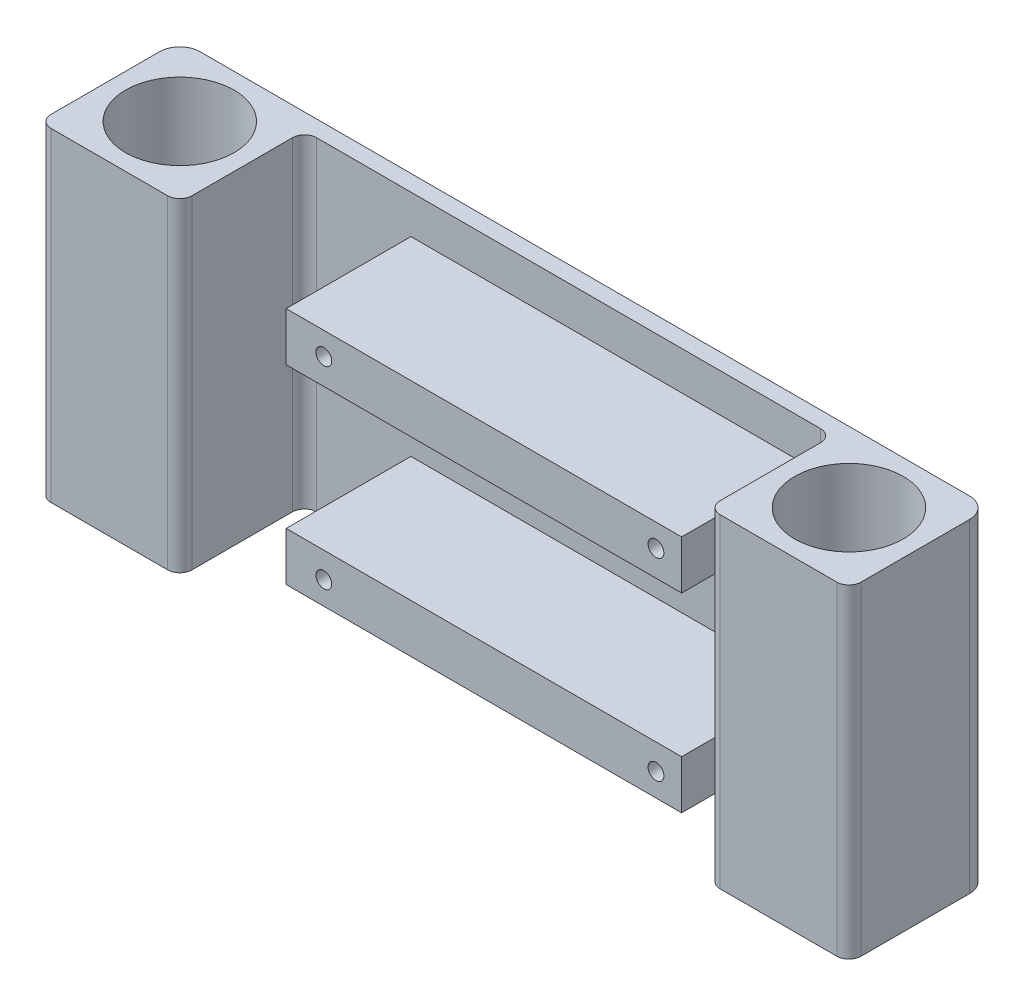
ISO-10303-21;
HEADER;
FILE_DESCRIPTION(('STEP AP214'),'2;1');
FILE_NAME('part.step','',(''),(''),'','','');
FILE_SCHEMA(('AUTOMOTIVE_DESIGN { 1 0 10303 214 1 1 1 1 }'));
ENDSEC;
DATA;
#1=APPLICATION_CONTEXT('core data for automotive mechanical design processes');
#2=APPLICATION_PROTOCOL_DEFINITION('international standard','automotive_design',2000,#1);
#3=PRODUCT_CONTEXT('',#1,'mechanical');
#4=PRODUCT('Part','Part','',(#3));
#5=PRODUCT_RELATED_PRODUCT_CATEGORY('part','',(#4));
#6=PRODUCT_DEFINITION_FORMATION('','',#4);
#7=PRODUCT_DEFINITION_CONTEXT('part definition',#1,'design');
#8=PRODUCT_DEFINITION('design','',#6,#7);
#9=PRODUCT_DEFINITION_SHAPE('','',#8);
#10=(LENGTH_UNIT() NAMED_UNIT(*) SI_UNIT(.MILLI.,.METRE.));
#11=(NAMED_UNIT(*) PLANE_ANGLE_UNIT() SI_UNIT($,.RADIAN.));
#12=(NAMED_UNIT(*) SI_UNIT($,.STERADIAN.) SOLID_ANGLE_UNIT());
#13=UNCERTAINTY_MEASURE_WITH_UNIT(LENGTH_MEASURE(1.E-05),#10,'distance_accuracy_value','');
#14=(GEOMETRIC_REPRESENTATION_CONTEXT(3) GLOBAL_UNCERTAINTY_ASSIGNED_CONTEXT((#13)) GLOBAL_UNIT_ASSIGNED_CONTEXT((#10,
#11,#12)) REPRESENTATION_CONTEXT('',''));
#15=CARTESIAN_POINT('',(0.,0.,0.));
#16=DIRECTION('',(0.,0.,1.));
#17=DIRECTION('',(1.,0.,0.));
#18=AXIS2_PLACEMENT_3D('',#15,#16,#17);
#19=CARTESIAN_POINT('',(0.,80.,-17.4));
#20=DIRECTION('',(0.,0.,-1.));
#21=DIRECTION('',(-1.,0.,0.));
#22=AXIS2_PLACEMENT_3D('',#19,#20,#21);
#23=PLANE('',#22);
#24=DIRECTION('',(1.,0.,0.));
#25=VECTOR('',#24,1.);
#26=CARTESIAN_POINT('',(0.,80.,-17.4));
#27=LINE('',#26,#25);
#28=CARTESIAN_POINT('',(-12.4,80.,-17.4));
#29=VERTEX_POINT('',#28);
#30=CARTESIAN_POINT('',(177.6,80.,-17.4));
#31=VERTEX_POINT('',#30);
#32=EDGE_CURVE('E317',#29,#31,#27,.T.);
#33=ORIENTED_EDGE('',*,*,#32,.T.);
#34=DIRECTION('',(0.,-1.,0.));
#35=VECTOR('',#34,1.);
#36=CARTESIAN_POINT('',(177.6,80.,-17.4));
#37=LINE('',#36,#35);
#38=CARTESIAN_POINT('',(177.6,0.,-17.4));
#39=VERTEX_POINT('',#38);
#40=EDGE_CURVE('E349',#31,#39,#37,.T.);
#41=ORIENTED_EDGE('',*,*,#40,.T.);
#42=DIRECTION('',(1.,0.,0.));
#43=VECTOR('',#42,1.);
#44=CARTESIAN_POINT('',(0.,0.,-17.4));
#45=LINE('',#44,#43);
#46=CARTESIAN_POINT('',(-12.4,0.,-17.4));
#47=VERTEX_POINT('',#46);
#48=EDGE_CURVE('E335',#47,#39,#45,.T.);
#49=ORIENTED_EDGE('',*,*,#48,.F.);
#50=DIRECTION('',(0.,-1.,0.));
#51=VECTOR('',#50,1.);
#52=CARTESIAN_POINT('',(-12.4,80.,-17.4));
#53=LINE('',#52,#51);
#54=EDGE_CURVE('E332',#47,#29,#53,.F.);
#55=ORIENTED_EDGE('',*,*,#54,.T.);
#56=EDGE_LOOP('',(#33,#41,#49,#55));
#57=FACE_BOUND('',#56,.T.);
#58=ADVANCED_FACE('F35',(#57),#23,.T.);
#59=CARTESIAN_POINT('',(-17.4,80.,0.));
#60=DIRECTION('',(1.,0.,0.));
#61=DIRECTION('',(0.,0.,-1.));
#62=AXIS2_PLACEMENT_3D('',#59,#60,#61);
#63=PLANE('',#62);
#64=DIRECTION('',(0.,0.,1.));
#65=VECTOR('',#64,1.);
#66=CARTESIAN_POINT('',(-17.4,0.,0.));
#67=LINE('',#66,#65);
#68=CARTESIAN_POINT('',(-17.4,0.,-12.4));
#69=VERTEX_POINT('',#68);
#70=CARTESIAN_POINT('',(-17.4,0.,14.4));
#71=VERTEX_POINT('',#70);
#72=EDGE_CURVE('E338',#69,#71,#67,.T.);
#73=ORIENTED_EDGE('',*,*,#72,.T.);
#74=DIRECTION('',(0.,-1.,0.));
#75=VECTOR('',#74,1.);
#76=CARTESIAN_POINT('',(-17.4,80.,14.4));
#77=LINE('',#76,#75);
#78=CARTESIAN_POINT('',(-17.4,80.,14.4));
#79=VERTEX_POINT('',#78);
#80=EDGE_CURVE('E402',#71,#79,#77,.F.);
#81=ORIENTED_EDGE('',*,*,#80,.T.);
#82=DIRECTION('',(0.,0.,1.));
#83=VECTOR('',#82,1.);
#84=CARTESIAN_POINT('',(-17.4,80.,0.));
#85=LINE('',#84,#83);
#86=CARTESIAN_POINT('',(-17.4,80.,-12.4));
#87=VERTEX_POINT('',#86);
#88=EDGE_CURVE('E321',#87,#79,#85,.T.);
#89=ORIENTED_EDGE('',*,*,#88,.F.);
#90=DIRECTION('',(0.,-1.,0.));
#91=VECTOR('',#90,1.);
#92=CARTESIAN_POINT('',(-17.4,0.,-12.4));
#93=LINE('',#92,#91);
#94=EDGE_CURVE('E362',#87,#69,#93,.T.);
#95=ORIENTED_EDGE('',*,*,#94,.T.);
#96=EDGE_LOOP('',(#73,#81,#89,#95));
#97=FACE_BOUND('',#96,.T.);
#98=ADVANCED_FACE('F470',(#97),#63,.F.);
#99=CARTESIAN_POINT('',(0.,80.,17.4));
#100=DIRECTION('',(0.,0.,-1.));
#101=DIRECTION('',(-1.,0.,0.));
#102=AXIS2_PLACEMENT_3D('',#99,#100,#101);
#103=PLANE('',#102);
#104=DIRECTION('',(1.,0.,0.));
#105=VECTOR('',#104,1.);
#106=CARTESIAN_POINT('',(0.,0.,17.4));
#107=LINE('',#106,#105);
#108=CARTESIAN_POINT('',(-14.4,0.,17.4));
#109=VERTEX_POINT('',#108);
#110=CARTESIAN_POINT('',(14.4,0.,17.4));
#111=VERTEX_POINT('',#110);
#112=EDGE_CURVE('E341',#109,#111,#107,.T.);
#113=ORIENTED_EDGE('',*,*,#112,.T.);
#114=DIRECTION('',(0.,-1.,0.));
#115=VECTOR('',#114,1.);
#116=CARTESIAN_POINT('',(14.4,80.,17.4));
#117=LINE('',#116,#115);
#118=CARTESIAN_POINT('',(14.4,80.,17.4));
#119=VERTEX_POINT('',#118);
#120=EDGE_CURVE('E400',#111,#119,#117,.F.);
#121=ORIENTED_EDGE('',*,*,#120,.T.);
#122=DIRECTION('',(1.,0.,0.));
#123=VECTOR('',#122,1.);
#124=CARTESIAN_POINT('',(0.,80.,17.4));
#125=LINE('',#124,#123);
#126=CARTESIAN_POINT('',(-14.4,80.,17.4));
#127=VERTEX_POINT('',#126);
#128=EDGE_CURVE('E324',#127,#119,#125,.T.);
#129=ORIENTED_EDGE('',*,*,#128,.F.);
#130=DIRECTION('',(0.,-1.,0.));
#131=VECTOR('',#130,1.);
#132=CARTESIAN_POINT('',(-14.4,80.,17.4));
#133=LINE('',#132,#131);
#134=EDGE_CURVE('E397',#127,#109,#133,.T.);
#135=ORIENTED_EDGE('',*,*,#134,.T.);
#136=EDGE_LOOP('',(#113,#121,#129,#135));
#137=FACE_BOUND('',#136,.T.);
#138=ADVANCED_FACE('F479',(#137),#103,.F.);
#139=CARTESIAN_POINT('',(17.4,80.,0.));
#140=DIRECTION('',(1.,0.,0.));
#141=DIRECTION('',(0.,0.,-1.));
#142=AXIS2_PLACEMENT_3D('',#139,#140,#141);
#143=PLANE('',#142);
#144=DIRECTION('',(0.,0.,1.));
#145=VECTOR('',#144,1.);
#146=CARTESIAN_POINT('',(17.4,0.,0.));
#147=LINE('',#146,#145);
#148=CARTESIAN_POINT('',(17.4,0.,-10.4));
#149=VERTEX_POINT('',#148);
#150=CARTESIAN_POINT('',(17.4,0.,14.4));
#151=VERTEX_POINT('',#150);
#152=EDGE_CURVE('E344',#149,#151,#147,.T.);
#153=ORIENTED_EDGE('',*,*,#152,.F.);
#154=DIRECTION('',(0.,-1.,0.));
#155=VECTOR('',#154,1.);
#156=CARTESIAN_POINT('',(17.4,80.,-10.4));
#157=LINE('',#156,#155);
#158=CARTESIAN_POINT('',(17.4,80.,-10.4));
#159=VERTEX_POINT('',#158);
#160=EDGE_CURVE('E409',#149,#159,#157,.F.);
#161=ORIENTED_EDGE('',*,*,#160,.T.);
#162=DIRECTION('',(0.,0.,1.));
#163=VECTOR('',#162,1.);
#164=CARTESIAN_POINT('',(17.4,80.,0.));
#165=LINE('',#164,#163);
#166=CARTESIAN_POINT('',(17.4,80.,14.4));
#167=VERTEX_POINT('',#166);
#168=EDGE_CURVE('E327',#159,#167,#165,.T.);
#169=ORIENTED_EDGE('',*,*,#168,.T.);
#170=DIRECTION('',(0.,-1.,0.));
#171=VECTOR('',#170,1.);
#172=CARTESIAN_POINT('',(17.4,0.,14.4));
#173=LINE('',#172,#171);
#174=EDGE_CURVE('E394',#167,#151,#173,.T.);
#175=ORIENTED_EDGE('',*,*,#174,.T.);
#176=EDGE_LOOP('',(#153,#161,#169,#175));
#177=FACE_BOUND('',#176,.T.);
#178=ADVANCED_FACE('F493',(#177),#143,.T.);
#179=CARTESIAN_POINT('',(0.,80.,0.));
#180=DIRECTION('',(0.,-1.,0.));
#181=DIRECTION('',(0.,0.,-1.));
#182=AXIS2_PLACEMENT_3D('',#179,#180,#181);
#183=CYLINDRICAL_SURFACE('',#182,13.4);
#184=CARTESIAN_POINT('',(0.,80.,0.));
#185=DIRECTION('',(0.,1.,0.));
#186=DIRECTION('',(0.,0.,1.));
#187=AXIS2_PLACEMENT_3D('',#184,#185,#186);
#188=CIRCLE('',#187,13.4);
#189=CARTESIAN_POINT('',(0.,80.,13.4));
#190=VERTEX_POINT('',#189);
#191=EDGE_CURVE('E314',#190,#190,#188,.T.);
#192=ORIENTED_EDGE('',*,*,#191,.T.);
#193=EDGE_LOOP('',(#192));
#194=FACE_BOUND('',#193,.T.);
#195=CARTESIAN_POINT('',(0.,0.,0.));
#196=DIRECTION('',(0.,1.,0.));
#197=DIRECTION('',(0.,0.,1.));
#198=AXIS2_PLACEMENT_3D('',#195,#196,#197);
#199=CIRCLE('',#198,13.4);
#200=CARTESIAN_POINT('',(0.,0.,13.4));
#201=VERTEX_POINT('',#200);
#202=EDGE_CURVE('E304',#201,#201,#199,.T.);
#203=ORIENTED_EDGE('',*,*,#202,.F.);
#204=EDGE_LOOP('',(#203));
#205=FACE_BOUND('',#204,.T.);
#206=ADVANCED_FACE('F495',(#194,#205),#183,.F.);
#207=CARTESIAN_POINT('',(0.,80.,-13.4));
#208=DIRECTION('',(0.,0.,-1.));
#209=DIRECTION('',(-1.,0.,0.));
#210=AXIS2_PLACEMENT_3D('',#207,#208,#209);
#211=PLANE('',#210);
#212=DIRECTION('',(1.,0.,0.));
#213=VECTOR('',#212,1.);
#214=CARTESIAN_POINT('',(141.285497720519,58.5,-13.4));
#215=LINE('',#214,#213);
#216=CARTESIAN_POINT('',(43.6593774492131,58.5,-13.4));
#217=VERTEX_POINT('',#216);
#218=CARTESIAN_POINT('',(141.285497720519,58.5,-13.4));
#219=VERTEX_POINT('',#218);
#220=EDGE_CURVE('E50',#217,#219,#215,.T.);
#221=ORIENTED_EDGE('',*,*,#220,.F.);
#222=DIRECTION('',(0.,-1.,0.));
#223=VECTOR('',#222,1.);
#224=CARTESIAN_POINT('',(43.6593774492131,58.5,-13.4));
#225=LINE('',#224,#223);
#226=CARTESIAN_POINT('',(43.6593774492131,70.5,-13.4));
#227=VERTEX_POINT('',#226);
#228=EDGE_CURVE('E55',#227,#217,#225,.T.);
#229=ORIENTED_EDGE('',*,*,#228,.F.);
#230=DIRECTION('',(-1.,0.,0.));
#231=VECTOR('',#230,1.);
#232=CARTESIAN_POINT('',(141.285497720519,70.5,-13.4));
#233=LINE('',#232,#231);
#234=CARTESIAN_POINT('',(141.285497720519,70.5,-13.4));
#235=VERTEX_POINT('',#234);
#236=EDGE_CURVE('E232',#235,#227,#233,.T.);
#237=ORIENTED_EDGE('',*,*,#236,.F.);
#238=DIRECTION('',(0.,1.,0.));
#239=VECTOR('',#238,1.);
#240=CARTESIAN_POINT('',(141.285497720519,58.5,-13.4));
#241=LINE('',#240,#239);
#242=EDGE_CURVE('E230',#219,#235,#241,.T.);
#243=ORIENTED_EDGE('',*,*,#242,.F.);
#244=EDGE_LOOP('',(#221,#229,#237,#243));
#245=FACE_BOUND('',#244,.T.);
#246=DIRECTION('',(1.,0.,0.));
#247=VECTOR('',#246,1.);
#248=CARTESIAN_POINT('',(141.285497720519,11.5,-13.4));
#249=LINE('',#248,#247);
#250=CARTESIAN_POINT('',(43.6593774492131,11.5,-13.4));
#251=VERTEX_POINT('',#250);
#252=CARTESIAN_POINT('',(141.285497720519,11.5,-13.4));
#253=VERTEX_POINT('',#252);
#254=EDGE_CURVE('E274',#251,#253,#249,.T.);
#255=ORIENTED_EDGE('',*,*,#254,.F.);
#256=DIRECTION('',(0.,-1.,0.));
#257=VECTOR('',#256,1.);
#258=CARTESIAN_POINT('',(43.6593774492131,11.5,-13.4));
#259=LINE('',#258,#257);
#260=CARTESIAN_POINT('',(43.6593774492131,23.5,-13.4));
#261=VERTEX_POINT('',#260);
#262=EDGE_CURVE('E271',#261,#251,#259,.T.);
#263=ORIENTED_EDGE('',*,*,#262,.F.);
#264=DIRECTION('',(-1.,0.,0.));
#265=VECTOR('',#264,1.);
#266=CARTESIAN_POINT('',(141.285497720519,23.5,-13.4));
#267=LINE('',#266,#265);
#268=CARTESIAN_POINT('',(141.285497720519,23.5,-13.4));
#269=VERTEX_POINT('',#268);
#270=EDGE_CURVE('E268',#269,#261,#267,.T.);
#271=ORIENTED_EDGE('',*,*,#270,.F.);
#272=DIRECTION('',(0.,1.,0.));
#273=VECTOR('',#272,1.);
#274=CARTESIAN_POINT('',(141.285497720519,11.5,-13.4));
#275=LINE('',#274,#273);
#276=EDGE_CURVE('E265',#253,#269,#275,.T.);
#277=ORIENTED_EDGE('',*,*,#276,.F.);
#278=EDGE_LOOP('',(#255,#263,#271,#277));
#279=FACE_BOUND('',#278,.T.);
#280=DIRECTION('',(1.,0.,0.));
#281=VECTOR('',#280,1.);
#282=CARTESIAN_POINT('',(0.,80.,-13.4));
#283=LINE('',#282,#281);
#284=CARTESIAN_POINT('',(20.4,80.,-13.4));
#285=VERTEX_POINT('',#284);
#286=CARTESIAN_POINT('',(144.8,80.,-13.4));
#287=VERTEX_POINT('',#286);
#288=EDGE_CURVE('E329',#285,#287,#283,.T.);
#289=ORIENTED_EDGE('',*,*,#288,.F.);
#290=DIRECTION('',(0.,-1.,0.));
#291=VECTOR('',#290,1.);
#292=CARTESIAN_POINT('',(20.4,80.,-13.4));
#293=LINE('',#292,#291);
#294=CARTESIAN_POINT('',(20.4,0.,-13.4));
#295=VERTEX_POINT('',#294);
#296=EDGE_CURVE('E406',#285,#295,#293,.T.);
#297=ORIENTED_EDGE('',*,*,#296,.T.);
#298=DIRECTION('',(1.,0.,0.));
#299=VECTOR('',#298,1.);
#300=CARTESIAN_POINT('',(0.,0.,-13.4));
#301=LINE('',#300,#299);
#302=CARTESIAN_POINT('',(144.8,0.,-13.4));
#303=VERTEX_POINT('',#302);
#304=EDGE_CURVE('E318',#295,#303,#301,.T.);
#305=ORIENTED_EDGE('',*,*,#304,.T.);
#306=DIRECTION('',(0.,-1.,0.));
#307=VECTOR('',#306,1.);
#308=CARTESIAN_POINT('',(144.8,80.,-13.4));
#309=LINE('',#308,#307);
#310=EDGE_CURVE('E404',#303,#287,#309,.F.);
#311=ORIENTED_EDGE('',*,*,#310,.T.);
#312=EDGE_LOOP('',(#289,#297,#305,#311));
#313=FACE_BOUND('',#312,.T.);
#314=ADVANCED_FACE('F427',(#245,#279,#313),#211,.F.);
#315=CARTESIAN_POINT('',(0.,80.,0.));
#316=DIRECTION('',(0.,1.,0.));
#317=DIRECTION('',(0.,0.,1.));
#318=AXIS2_PLACEMENT_3D('',#315,#316,#317);
#319=PLANE('',#318);
#320=ORIENTED_EDGE('',*,*,#191,.F.);
#321=EDGE_LOOP('',(#320));
#322=FACE_BOUND('',#321,.T.);
#323=DIRECTION('',(-1.,0.,0.));
#324=VECTOR('',#323,1.);
#325=CARTESIAN_POINT('',(165.2,80.,17.4));
#326=LINE('',#325,#324);
#327=CARTESIAN_POINT('',(179.6,80.,17.4));
#328=VERTEX_POINT('',#327);
#329=CARTESIAN_POINT('',(150.8,80.,17.4));
#330=VERTEX_POINT('',#329);
#331=EDGE_CURVE('E298',#328,#330,#326,.T.);
#332=ORIENTED_EDGE('',*,*,#331,.F.);
#333=CARTESIAN_POINT('',(179.6,80.,14.4));
#334=DIRECTION('',(0.,1.,0.));
#335=DIRECTION('',(0.,0.,1.));
#336=AXIS2_PLACEMENT_3D('',#333,#334,#335);
#337=CIRCLE('',#336,3.);
#338=CARTESIAN_POINT('',(182.6,80.,14.4));
#339=VERTEX_POINT('',#338);
#340=EDGE_CURVE('E389',#328,#339,#337,.T.);
#341=ORIENTED_EDGE('',*,*,#340,.T.);
#342=DIRECTION('',(0.,0.,1.));
#343=VECTOR('',#342,1.);
#344=CARTESIAN_POINT('',(182.6,80.,0.));
#345=LINE('',#344,#343);
#346=CARTESIAN_POINT('',(182.6,80.,-12.4));
#347=VERTEX_POINT('',#346);
#348=EDGE_CURVE('E301',#347,#339,#345,.T.);
#349=ORIENTED_EDGE('',*,*,#348,.F.);
#350=CARTESIAN_POINT('',(177.6,80.,-12.4));
#351=DIRECTION('',(0.,1.,0.));
#352=DIRECTION('',(0.,0.,1.));
#353=AXIS2_PLACEMENT_3D('',#350,#351,#352);
#354=CIRCLE('',#353,5.);
#355=EDGE_CURVE('E360',#347,#31,#354,.T.);
#356=ORIENTED_EDGE('',*,*,#355,.T.);
#357=ORIENTED_EDGE('',*,*,#32,.F.);
#358=CARTESIAN_POINT('',(-12.4,80.,-12.4));
#359=DIRECTION('',(0.,1.,0.));
#360=DIRECTION('',(0.,0.,1.));
#361=AXIS2_PLACEMENT_3D('',#358,#359,#360);
#362=CIRCLE('',#361,5.);
#363=EDGE_CURVE('E358',#29,#87,#362,.T.);
#364=ORIENTED_EDGE('',*,*,#363,.T.);
#365=ORIENTED_EDGE('',*,*,#88,.T.);
#366=CARTESIAN_POINT('',(-14.4,80.,14.4));
#367=DIRECTION('',(0.,1.,0.));
#368=DIRECTION('',(0.,0.,1.));
#369=AXIS2_PLACEMENT_3D('',#366,#367,#368);
#370=CIRCLE('',#369,3.);
#371=EDGE_CURVE('E382',#79,#127,#370,.T.);
#372=ORIENTED_EDGE('',*,*,#371,.T.);
#373=ORIENTED_EDGE('',*,*,#128,.T.);
#374=CARTESIAN_POINT('',(14.4,80.,14.4));
#375=DIRECTION('',(0.,1.,0.));
#376=DIRECTION('',(0.,0.,1.));
#377=AXIS2_PLACEMENT_3D('',#374,#375,#376);
#378=CIRCLE('',#377,3.);
#379=EDGE_CURVE('E384',#119,#167,#378,.T.);
#380=ORIENTED_EDGE('',*,*,#379,.T.);
#381=ORIENTED_EDGE('',*,*,#168,.F.);
#382=CARTESIAN_POINT('',(20.4,80.,-10.4));
#383=DIRECTION('',(0.,1.,0.));
#384=DIRECTION('',(0.,0.,1.));
#385=AXIS2_PLACEMENT_3D('',#382,#383,#384);
#386=CIRCLE('',#385,3.);
#387=EDGE_CURVE('E416',#159,#285,#386,.F.);
#388=ORIENTED_EDGE('',*,*,#387,.T.);
#389=ORIENTED_EDGE('',*,*,#288,.T.);
#390=CARTESIAN_POINT('',(144.8,80.,-10.4));
#391=DIRECTION('',(0.,1.,0.));
#392=DIRECTION('',(0.,0.,1.));
#393=AXIS2_PLACEMENT_3D('',#390,#391,#392);
#394=CIRCLE('',#393,3.);
#395=CARTESIAN_POINT('',(147.8,80.,-10.4));
#396=VERTEX_POINT('',#395);
#397=EDGE_CURVE('E11',#287,#396,#394,.F.);
#398=ORIENTED_EDGE('',*,*,#397,.T.);
#399=DIRECTION('',(0.,0.,1.));
#400=VECTOR('',#399,1.);
#401=CARTESIAN_POINT('',(147.8,80.,0.));
#402=LINE('',#401,#400);
#403=CARTESIAN_POINT('',(147.8,80.,14.4));
#404=VERTEX_POINT('',#403);
#405=EDGE_CURVE('E295',#396,#404,#402,.T.);
#406=ORIENTED_EDGE('',*,*,#405,.T.);
#407=CARTESIAN_POINT('',(150.8,80.,14.4));
#408=DIRECTION('',(0.,1.,0.));
#409=DIRECTION('',(0.,0.,1.));
#410=AXIS2_PLACEMENT_3D('',#407,#408,#409);
#411=CIRCLE('',#410,3.);
#412=EDGE_CURVE('E387',#404,#330,#411,.T.);
#413=ORIENTED_EDGE('',*,*,#412,.T.);
#414=EDGE_LOOP('',(#332,#341,#349,#356,#357,#364,#365,#372,#373,#380,#381,#388,#389,#398,#406,#413));
#415=FACE_BOUND('',#414,.T.);
#416=CARTESIAN_POINT('',(165.2,80.,0.));
#417=DIRECTION('',(0.,-1.,0.));
#418=DIRECTION('',(0.,0.,1.));
#419=AXIS2_PLACEMENT_3D('',#416,#417,#418);
#420=CIRCLE('',#419,13.4);
#421=CARTESIAN_POINT('',(165.2,80.,13.4));
#422=VERTEX_POINT('',#421);
#423=EDGE_CURVE('E292',#422,#422,#420,.T.);
#424=ORIENTED_EDGE('',*,*,#423,.T.);
#425=EDGE_LOOP('',(#424));
#426=FACE_BOUND('',#425,.T.);
#427=ADVANCED_FACE('F433',(#322,#415,#426),#319,.T.);
#428=CARTESIAN_POINT('',(0.,0.,0.));
#429=DIRECTION('',(0.,1.,0.));
#430=DIRECTION('',(0.,0.,1.));
#431=AXIS2_PLACEMENT_3D('',#428,#429,#430);
#432=PLANE('',#431);
#433=ORIENTED_EDGE('',*,*,#202,.T.);
#434=EDGE_LOOP('',(#433));
#435=FACE_BOUND('',#434,.T.);
#436=DIRECTION('',(0.,0.,1.));
#437=VECTOR('',#436,1.);
#438=CARTESIAN_POINT('',(182.6,0.,0.));
#439=LINE('',#438,#437);
#440=CARTESIAN_POINT('',(182.6,0.,-12.4));
#441=VERTEX_POINT('',#440);
#442=CARTESIAN_POINT('',(182.6,0.,14.4));
#443=VERTEX_POINT('',#442);
#444=EDGE_CURVE('E296',#441,#443,#439,.T.);
#445=ORIENTED_EDGE('',*,*,#444,.T.);
#446=CARTESIAN_POINT('',(179.6,0.,14.4));
#447=DIRECTION('',(0.,1.,0.));
#448=DIRECTION('',(0.,0.,1.));
#449=AXIS2_PLACEMENT_3D('',#446,#447,#448);
#450=CIRCLE('',#449,3.);
#451=CARTESIAN_POINT('',(179.6,0.,17.4));
#452=VERTEX_POINT('',#451);
#453=EDGE_CURVE('E375',#443,#452,#450,.F.);
#454=ORIENTED_EDGE('',*,*,#453,.T.);
#455=DIRECTION('',(-1.,0.,0.));
#456=VECTOR('',#455,1.);
#457=CARTESIAN_POINT('',(165.2,0.,17.4));
#458=LINE('',#457,#456);
#459=CARTESIAN_POINT('',(150.8,0.,17.4));
#460=VERTEX_POINT('',#459);
#461=EDGE_CURVE('E309',#452,#460,#458,.T.);
#462=ORIENTED_EDGE('',*,*,#461,.T.);
#463=CARTESIAN_POINT('',(150.8,0.,14.4));
#464=DIRECTION('',(0.,1.,0.));
#465=DIRECTION('',(0.,0.,1.));
#466=AXIS2_PLACEMENT_3D('',#463,#464,#465);
#467=CIRCLE('',#466,3.);
#468=CARTESIAN_POINT('',(147.8,0.,14.4));
#469=VERTEX_POINT('',#468);
#470=EDGE_CURVE('E372',#460,#469,#467,.F.);
#471=ORIENTED_EDGE('',*,*,#470,.T.);
#472=DIRECTION('',(0.,0.,1.));
#473=VECTOR('',#472,1.);
#474=CARTESIAN_POINT('',(147.8,0.,0.));
#475=LINE('',#474,#473);
#476=CARTESIAN_POINT('',(147.8,0.,-10.4));
#477=VERTEX_POINT('',#476);
#478=EDGE_CURVE('E307',#477,#469,#475,.T.);
#479=ORIENTED_EDGE('',*,*,#478,.F.);
#480=CARTESIAN_POINT('',(144.8,0.,-10.4));
#481=DIRECTION('',(0.,1.,0.));
#482=DIRECTION('',(0.,0.,1.));
#483=AXIS2_PLACEMENT_3D('',#480,#481,#482);
#484=CIRCLE('',#483,3.);
#485=EDGE_CURVE('E43',#477,#303,#484,.T.);
#486=ORIENTED_EDGE('',*,*,#485,.T.);
#487=ORIENTED_EDGE('',*,*,#304,.F.);
#488=CARTESIAN_POINT('',(20.4,0.,-10.4));
#489=DIRECTION('',(0.,1.,0.));
#490=DIRECTION('',(0.,0.,1.));
#491=AXIS2_PLACEMENT_3D('',#488,#489,#490);
#492=CIRCLE('',#491,3.);
#493=EDGE_CURVE('E414',#295,#149,#492,.T.);
#494=ORIENTED_EDGE('',*,*,#493,.T.);
#495=ORIENTED_EDGE('',*,*,#152,.T.);
#496=CARTESIAN_POINT('',(14.4,0.,14.4));
#497=DIRECTION('',(0.,1.,0.));
#498=DIRECTION('',(0.,0.,1.));
#499=AXIS2_PLACEMENT_3D('',#496,#497,#498);
#500=CIRCLE('',#499,3.);
#501=EDGE_CURVE('E370',#151,#111,#500,.F.);
#502=ORIENTED_EDGE('',*,*,#501,.T.);
#503=ORIENTED_EDGE('',*,*,#112,.F.);
#504=CARTESIAN_POINT('',(-14.4,0.,14.4));
#505=DIRECTION('',(0.,1.,0.));
#506=DIRECTION('',(0.,0.,1.));
#507=AXIS2_PLACEMENT_3D('',#504,#505,#506);
#508=CIRCLE('',#507,3.);
#509=EDGE_CURVE('E368',#109,#71,#508,.F.);
#510=ORIENTED_EDGE('',*,*,#509,.T.);
#511=ORIENTED_EDGE('',*,*,#72,.F.);
#512=CARTESIAN_POINT('',(-12.4,0.,-12.4));
#513=DIRECTION('',(0.,1.,0.));
#514=DIRECTION('',(0.,0.,1.));
#515=AXIS2_PLACEMENT_3D('',#512,#513,#514);
#516=CIRCLE('',#515,5.);
#517=EDGE_CURVE('E352',#69,#47,#516,.F.);
#518=ORIENTED_EDGE('',*,*,#517,.T.);
#519=ORIENTED_EDGE('',*,*,#48,.T.);
#520=CARTESIAN_POINT('',(177.6,0.,-12.4));
#521=DIRECTION('',(0.,1.,0.));
#522=DIRECTION('',(0.,0.,1.));
#523=AXIS2_PLACEMENT_3D('',#520,#521,#522);
#524=CIRCLE('',#523,5.);
#525=EDGE_CURVE('E354',#39,#441,#524,.F.);
#526=ORIENTED_EDGE('',*,*,#525,.T.);
#527=EDGE_LOOP('',(#445,#454,#462,#471,#479,#486,#487,#494,#495,#502,#503,#510,#511,#518,#519,#526));
#528=FACE_BOUND('',#527,.T.);
#529=CARTESIAN_POINT('',(165.2,0.,0.));
#530=DIRECTION('',(0.,-1.,0.));
#531=DIRECTION('',(0.,0.,1.));
#532=AXIS2_PLACEMENT_3D('',#529,#530,#531);
#533=CIRCLE('',#532,13.4);
#534=CARTESIAN_POINT('',(165.2,0.,13.4));
#535=VERTEX_POINT('',#534);
#536=EDGE_CURVE('E289',#535,#535,#533,.T.);
#537=ORIENTED_EDGE('',*,*,#536,.F.);
#538=EDGE_LOOP('',(#537));
#539=FACE_BOUND('',#538,.T.);
#540=ADVANCED_FACE('F420',(#435,#528,#539),#432,.F.);
#541=CARTESIAN_POINT('',(147.8,80.,0.));
#542=DIRECTION('',(1.,0.,0.));
#543=DIRECTION('',(0.,0.,-1.));
#544=AXIS2_PLACEMENT_3D('',#541,#542,#543);
#545=PLANE('',#544);
#546=ORIENTED_EDGE('',*,*,#405,.F.);
#547=DIRECTION('',(0.,-1.,0.));
#548=VECTOR('',#547,1.);
#549=CARTESIAN_POINT('',(147.8,0.,-10.4));
#550=LINE('',#549,#548);
#551=EDGE_CURVE('E411',#396,#477,#550,.T.);
#552=ORIENTED_EDGE('',*,*,#551,.T.);
#553=ORIENTED_EDGE('',*,*,#478,.T.);
#554=DIRECTION('',(0.,-1.,0.));
#555=VECTOR('',#554,1.);
#556=CARTESIAN_POINT('',(147.8,80.,14.4));
#557=LINE('',#556,#555);
#558=EDGE_CURVE('E391',#469,#404,#557,.F.);
#559=ORIENTED_EDGE('',*,*,#558,.T.);
#560=EDGE_LOOP('',(#546,#552,#553,#559));
#561=FACE_BOUND('',#560,.T.);
#562=ADVANCED_FACE('F436',(#561),#545,.F.);
#563=CARTESIAN_POINT('',(165.2,80.,17.4));
#564=DIRECTION('',(0.,0.,1.));
#565=DIRECTION('',(1.,0.,0.));
#566=AXIS2_PLACEMENT_3D('',#563,#564,#565);
#567=PLANE('',#566);
#568=ORIENTED_EDGE('',*,*,#461,.F.);
#569=DIRECTION('',(0.,-1.,0.));
#570=VECTOR('',#569,1.);
#571=CARTESIAN_POINT('',(179.6,80.,17.4));
#572=LINE('',#571,#570);
#573=EDGE_CURVE('E380',#452,#328,#572,.F.);
#574=ORIENTED_EDGE('',*,*,#573,.T.);
#575=ORIENTED_EDGE('',*,*,#331,.T.);
#576=DIRECTION('',(0.,-1.,0.));
#577=VECTOR('',#576,1.);
#578=CARTESIAN_POINT('',(150.8,0.,17.4));
#579=LINE('',#578,#577);
#580=EDGE_CURVE('E377',#330,#460,#579,.T.);
#581=ORIENTED_EDGE('',*,*,#580,.T.);
#582=EDGE_LOOP('',(#568,#574,#575,#581));
#583=FACE_BOUND('',#582,.T.);
#584=ADVANCED_FACE('F445',(#583),#567,.T.);
#585=CARTESIAN_POINT('',(182.6,80.,0.));
#586=DIRECTION('',(1.,0.,0.));
#587=DIRECTION('',(0.,0.,-1.));
#588=AXIS2_PLACEMENT_3D('',#585,#586,#587);
#589=PLANE('',#588);
#590=ORIENTED_EDGE('',*,*,#348,.T.);
#591=DIRECTION('',(0.,-1.,0.));
#592=VECTOR('',#591,1.);
#593=CARTESIAN_POINT('',(182.6,80.,14.4));
#594=LINE('',#593,#592);
#595=EDGE_CURVE('E365',#339,#443,#594,.T.);
#596=ORIENTED_EDGE('',*,*,#595,.T.);
#597=ORIENTED_EDGE('',*,*,#444,.F.);
#598=DIRECTION('',(0.,-1.,0.));
#599=VECTOR('',#598,1.);
#600=CARTESIAN_POINT('',(182.6,80.,-12.4));
#601=LINE('',#600,#599);
#602=EDGE_CURVE('E356',#441,#347,#601,.F.);
#603=ORIENTED_EDGE('',*,*,#602,.T.);
#604=EDGE_LOOP('',(#590,#596,#597,#603));
#605=FACE_BOUND('',#604,.T.);
#606=ADVANCED_FACE('F453',(#605),#589,.T.);
#607=CARTESIAN_POINT('',(165.2,80.,0.));
#608=DIRECTION('',(0.,-1.,0.));
#609=DIRECTION('',(0.,0.,-1.));
#610=AXIS2_PLACEMENT_3D('',#607,#608,#609);
#611=CYLINDRICAL_SURFACE('',#610,13.4);
#612=ORIENTED_EDGE('',*,*,#423,.F.);
#613=EDGE_LOOP('',(#612));
#614=FACE_BOUND('',#613,.T.);
#615=ORIENTED_EDGE('',*,*,#536,.T.);
#616=EDGE_LOOP('',(#615));
#617=FACE_BOUND('',#616,.T.);
#618=ADVANCED_FACE('F514',(#614,#617),#611,.F.);
#619=CARTESIAN_POINT('',(177.6,80.,-12.4));
#620=DIRECTION('',(0.,-1.,0.));
#621=DIRECTION('',(0.,0.,-1.));
#622=AXIS2_PLACEMENT_3D('',#619,#620,#621);
#623=CYLINDRICAL_SURFACE('',#622,5.);
#624=ORIENTED_EDGE('',*,*,#355,.F.);
#625=ORIENTED_EDGE('',*,*,#602,.F.);
#626=ORIENTED_EDGE('',*,*,#525,.F.);
#627=ORIENTED_EDGE('',*,*,#40,.F.);
#628=EDGE_LOOP('',(#624,#625,#626,#627));
#629=FACE_BOUND('',#628,.T.);
#630=ADVANCED_FACE('F457',(#629),#623,.T.);
#631=CARTESIAN_POINT('',(-12.4,80.,-12.4));
#632=DIRECTION('',(0.,1.,0.));
#633=DIRECTION('',(0.,0.,1.));
#634=AXIS2_PLACEMENT_3D('',#631,#632,#633);
#635=CYLINDRICAL_SURFACE('',#634,5.);
#636=ORIENTED_EDGE('',*,*,#363,.F.);
#637=ORIENTED_EDGE('',*,*,#54,.F.);
#638=ORIENTED_EDGE('',*,*,#517,.F.);
#639=ORIENTED_EDGE('',*,*,#94,.F.);
#640=EDGE_LOOP('',(#636,#637,#638,#639));
#641=FACE_BOUND('',#640,.T.);
#642=ADVANCED_FACE('F465',(#641),#635,.T.);
#643=CARTESIAN_POINT('',(179.6,80.,14.4));
#644=DIRECTION('',(0.,-1.,0.));
#645=DIRECTION('',(0.,0.,-1.));
#646=AXIS2_PLACEMENT_3D('',#643,#644,#645);
#647=CYLINDRICAL_SURFACE('',#646,3.);
#648=ORIENTED_EDGE('',*,*,#340,.F.);
#649=ORIENTED_EDGE('',*,*,#573,.F.);
#650=ORIENTED_EDGE('',*,*,#453,.F.);
#651=ORIENTED_EDGE('',*,*,#595,.F.);
#652=EDGE_LOOP('',(#648,#649,#650,#651));
#653=FACE_BOUND('',#652,.T.);
#654=ADVANCED_FACE('F448',(#653),#647,.T.);
#655=CARTESIAN_POINT('',(150.8,80.,14.4));
#656=DIRECTION('',(0.,1.,0.));
#657=DIRECTION('',(0.,0.,1.));
#658=AXIS2_PLACEMENT_3D('',#655,#656,#657);
#659=CYLINDRICAL_SURFACE('',#658,3.);
#660=ORIENTED_EDGE('',*,*,#412,.F.);
#661=ORIENTED_EDGE('',*,*,#558,.F.);
#662=ORIENTED_EDGE('',*,*,#470,.F.);
#663=ORIENTED_EDGE('',*,*,#580,.F.);
#664=EDGE_LOOP('',(#660,#661,#662,#663));
#665=FACE_BOUND('',#664,.T.);
#666=ADVANCED_FACE('F441',(#665),#659,.T.);
#667=CARTESIAN_POINT('',(14.4,80.,14.4));
#668=DIRECTION('',(0.,1.,0.));
#669=DIRECTION('',(0.,0.,1.));
#670=AXIS2_PLACEMENT_3D('',#667,#668,#669);
#671=CYLINDRICAL_SURFACE('',#670,3.);
#672=ORIENTED_EDGE('',*,*,#379,.F.);
#673=ORIENTED_EDGE('',*,*,#120,.F.);
#674=ORIENTED_EDGE('',*,*,#501,.F.);
#675=ORIENTED_EDGE('',*,*,#174,.F.);
#676=EDGE_LOOP('',(#672,#673,#674,#675));
#677=FACE_BOUND('',#676,.T.);
#678=ADVANCED_FACE('F484',(#677),#671,.T.);
#679=CARTESIAN_POINT('',(-14.4,80.,14.4));
#680=DIRECTION('',(0.,-1.,0.));
#681=DIRECTION('',(0.,0.,-1.));
#682=AXIS2_PLACEMENT_3D('',#679,#680,#681);
#683=CYLINDRICAL_SURFACE('',#682,3.);
#684=ORIENTED_EDGE('',*,*,#371,.F.);
#685=ORIENTED_EDGE('',*,*,#80,.F.);
#686=ORIENTED_EDGE('',*,*,#509,.F.);
#687=ORIENTED_EDGE('',*,*,#134,.F.);
#688=EDGE_LOOP('',(#684,#685,#686,#687));
#689=FACE_BOUND('',#688,.T.);
#690=ADVANCED_FACE('F474',(#689),#683,.T.);
#691=CARTESIAN_POINT('',(20.4,80.,-10.4));
#692=DIRECTION('',(0.,-1.,0.));
#693=DIRECTION('',(0.,0.,-1.));
#694=AXIS2_PLACEMENT_3D('',#691,#692,#693);
#695=CYLINDRICAL_SURFACE('',#694,3.);
#696=ORIENTED_EDGE('',*,*,#387,.F.);
#697=ORIENTED_EDGE('',*,*,#160,.F.);
#698=ORIENTED_EDGE('',*,*,#493,.F.);
#699=ORIENTED_EDGE('',*,*,#296,.F.);
#700=EDGE_LOOP('',(#696,#697,#698,#699));
#701=FACE_BOUND('',#700,.T.);
#702=ADVANCED_FACE('F491',(#701),#695,.F.);
#703=CARTESIAN_POINT('',(144.8,80.,-10.4));
#704=DIRECTION('',(0.,1.,0.));
#705=DIRECTION('',(0.,0.,1.));
#706=AXIS2_PLACEMENT_3D('',#703,#704,#705);
#707=CYLINDRICAL_SURFACE('',#706,3.);
#708=ORIENTED_EDGE('',*,*,#397,.F.);
#709=ORIENTED_EDGE('',*,*,#310,.F.);
#710=ORIENTED_EDGE('',*,*,#485,.F.);
#711=ORIENTED_EDGE('',*,*,#551,.F.);
#712=EDGE_LOOP('',(#708,#709,#710,#711));
#713=FACE_BOUND('',#712,.T.);
#714=ADVANCED_FACE('F37',(#713),#707,.F.);
#715=CARTESIAN_POINT('',(52.955461896114,17.1906054290218,115.760862944707));
#716=DIRECTION('',(0.,0.,-1.));
#717=DIRECTION('',(-1.,0.,0.));
#718=AXIS2_PLACEMENT_3D('',#715,#716,#717);
#719=CYLINDRICAL_SURFACE('',#718,1.95);
#720=CARTESIAN_POINT('',(52.955461896114,17.1906054290218,-13.4));
#721=DIRECTION('',(0.,0.,1.));
#722=DIRECTION('',(1.,0.,0.));
#723=AXIS2_PLACEMENT_3D('',#720,#721,#722);
#724=CIRCLE('',#723,1.95);
#725=CARTESIAN_POINT('',(54.905461896114,17.1906054290218,-13.4));
#726=VERTEX_POINT('',#725);
#727=EDGE_CURVE('E262',#726,#726,#724,.T.);
#728=ORIENTED_EDGE('',*,*,#727,.F.);
#729=EDGE_LOOP('',(#728));
#730=FACE_BOUND('',#729,.T.);
#731=CARTESIAN_POINT('',(52.955461896114,17.1906054290218,17.4));
#732=DIRECTION('',(0.,0.,1.));
#733=DIRECTION('',(1.,0.,0.));
#734=AXIS2_PLACEMENT_3D('',#731,#732,#733);
#735=CIRCLE('',#734,1.95);
#736=CARTESIAN_POINT('',(54.905461896114,17.1906054290218,17.4));
#737=VERTEX_POINT('',#736);
#738=EDGE_CURVE('E244',#737,#737,#735,.T.);
#739=ORIENTED_EDGE('',*,*,#738,.T.);
#740=EDGE_LOOP('',(#739));
#741=FACE_BOUND('',#740,.T.);
#742=ADVANCED_FACE('F528',(#730,#741),#719,.F.);
#743=CARTESIAN_POINT('',(141.285497720519,11.5,115.760862944707));
#744=DIRECTION('',(0.,1.,0.));
#745=DIRECTION('',(0.,0.,1.));
#746=AXIS2_PLACEMENT_3D('',#743,#744,#745);
#747=PLANE('',#746);
#748=DIRECTION('',(1.,0.,0.));
#749=VECTOR('',#748,1.);
#750=CARTESIAN_POINT('',(141.285497720519,11.5,17.4));
#751=LINE('',#750,#749);
#752=CARTESIAN_POINT('',(43.6593774492131,11.5,17.4));
#753=VERTEX_POINT('',#752);
#754=CARTESIAN_POINT('',(141.285497720519,11.5,17.4));
#755=VERTEX_POINT('',#754);
#756=EDGE_CURVE('E247',#753,#755,#751,.T.);
#757=ORIENTED_EDGE('',*,*,#756,.F.);
#758=DIRECTION('',(0.,0.,-1.));
#759=VECTOR('',#758,1.);
#760=CARTESIAN_POINT('',(43.6593774492131,11.5,115.760862944707));
#761=LINE('',#760,#759);
#762=EDGE_CURVE('E280',#753,#251,#761,.T.);
#763=ORIENTED_EDGE('',*,*,#762,.T.);
#764=ORIENTED_EDGE('',*,*,#254,.T.);
#765=DIRECTION('',(0.,0.,-1.));
#766=VECTOR('',#765,1.);
#767=CARTESIAN_POINT('',(141.285497720519,11.5,115.760862944707));
#768=LINE('',#767,#766);
#769=EDGE_CURVE('E277',#755,#253,#768,.T.);
#770=ORIENTED_EDGE('',*,*,#769,.F.);
#771=EDGE_LOOP('',(#757,#763,#764,#770));
#772=FACE_BOUND('',#771,.T.);
#773=ADVANCED_FACE('F532',(#772),#747,.F.);
#774=CARTESIAN_POINT('',(43.6593774492131,11.5,115.760862944707));
#775=DIRECTION('',(1.,0.,0.));
#776=DIRECTION('',(0.,0.,-1.));
#777=AXIS2_PLACEMENT_3D('',#774,#775,#776);
#778=PLANE('',#777);
#779=DIRECTION('',(0.,-1.,0.));
#780=VECTOR('',#779,1.);
#781=CARTESIAN_POINT('',(43.6593774492131,11.5,17.4));
#782=LINE('',#781,#780);
#783=CARTESIAN_POINT('',(43.6593774492131,23.5,17.4));
#784=VERTEX_POINT('',#783);
#785=EDGE_CURVE('E250',#784,#753,#782,.T.);
#786=ORIENTED_EDGE('',*,*,#785,.F.);
#787=DIRECTION('',(0.,0.,-1.));
#788=VECTOR('',#787,1.);
#789=CARTESIAN_POINT('',(43.6593774492131,23.5,115.760862944707));
#790=LINE('',#789,#788);
#791=EDGE_CURVE('E283',#784,#261,#790,.T.);
#792=ORIENTED_EDGE('',*,*,#791,.T.);
#793=ORIENTED_EDGE('',*,*,#262,.T.);
#794=ORIENTED_EDGE('',*,*,#762,.F.);
#795=EDGE_LOOP('',(#786,#792,#793,#794));
#796=FACE_BOUND('',#795,.T.);
#797=ADVANCED_FACE('F538',(#796),#778,.F.);
#798=CARTESIAN_POINT('',(141.285497720519,23.5,115.760862944707));
#799=DIRECTION('',(0.,-1.,0.));
#800=DIRECTION('',(0.,0.,-1.));
#801=AXIS2_PLACEMENT_3D('',#798,#799,#800);
#802=PLANE('',#801);
#803=DIRECTION('',(-1.,0.,0.));
#804=VECTOR('',#803,1.);
#805=CARTESIAN_POINT('',(141.285497720519,23.5,17.4));
#806=LINE('',#805,#804);
#807=CARTESIAN_POINT('',(141.285497720519,23.5,17.4));
#808=VERTEX_POINT('',#807);
#809=EDGE_CURVE('E253',#808,#784,#806,.T.);
#810=ORIENTED_EDGE('',*,*,#809,.F.);
#811=DIRECTION('',(0.,0.,-1.));
#812=VECTOR('',#811,1.);
#813=CARTESIAN_POINT('',(141.285497720519,23.5,115.760862944707));
#814=LINE('',#813,#812);
#815=EDGE_CURVE('E286',#808,#269,#814,.T.);
#816=ORIENTED_EDGE('',*,*,#815,.T.);
#817=ORIENTED_EDGE('',*,*,#270,.T.);
#818=ORIENTED_EDGE('',*,*,#791,.F.);
#819=EDGE_LOOP('',(#810,#816,#817,#818));
#820=FACE_BOUND('',#819,.T.);
#821=ADVANCED_FACE('F549',(#820),#802,.F.);
#822=CARTESIAN_POINT('',(141.285497720519,11.5,115.760862944707));
#823=DIRECTION('',(-1.,0.,0.));
#824=DIRECTION('',(0.,-1.,0.));
#825=AXIS2_PLACEMENT_3D('',#822,#823,#824);
#826=PLANE('',#825);
#827=DIRECTION('',(0.,1.,0.));
#828=VECTOR('',#827,1.);
#829=CARTESIAN_POINT('',(141.285497720519,11.5,17.4));
#830=LINE('',#829,#828);
#831=EDGE_CURVE('E256',#755,#808,#830,.T.);
#832=ORIENTED_EDGE('',*,*,#831,.F.);
#833=ORIENTED_EDGE('',*,*,#769,.T.);
#834=ORIENTED_EDGE('',*,*,#276,.T.);
#835=ORIENTED_EDGE('',*,*,#815,.F.);
#836=EDGE_LOOP('',(#832,#833,#834,#835));
#837=FACE_BOUND('',#836,.T.);
#838=ADVANCED_FACE('F553',(#837),#826,.F.);
#839=CARTESIAN_POINT('',(134.955461896114,17.1906054290218,115.760862944707));
#840=DIRECTION('',(0.,0.,-1.));
#841=DIRECTION('',(-1.,0.,0.));
#842=AXIS2_PLACEMENT_3D('',#839,#840,#841);
#843=CYLINDRICAL_SURFACE('',#842,1.95);
#844=CARTESIAN_POINT('',(134.955461896114,17.1906054290218,-13.4));
#845=DIRECTION('',(0.,0.,1.));
#846=DIRECTION('',(1.,0.,0.));
#847=AXIS2_PLACEMENT_3D('',#844,#845,#846);
#848=CIRCLE('',#847,1.95);
#849=CARTESIAN_POINT('',(136.905461896114,17.1906054290218,-13.4));
#850=VERTEX_POINT('',#849);
#851=EDGE_CURVE('E259',#850,#850,#848,.T.);
#852=ORIENTED_EDGE('',*,*,#851,.F.);
#853=EDGE_LOOP('',(#852));
#854=FACE_BOUND('',#853,.T.);
#855=CARTESIAN_POINT('',(134.955461896114,17.1906054290218,17.4));
#856=DIRECTION('',(0.,0.,1.));
#857=DIRECTION('',(1.,0.,0.));
#858=AXIS2_PLACEMENT_3D('',#855,#856,#857);
#859=CIRCLE('',#858,1.95);
#860=CARTESIAN_POINT('',(136.905461896114,17.1906054290218,17.4));
#861=VERTEX_POINT('',#860);
#862=EDGE_CURVE('E241',#861,#861,#859,.T.);
#863=ORIENTED_EDGE('',*,*,#862,.T.);
#864=EDGE_LOOP('',(#863));
#865=FACE_BOUND('',#864,.T.);
#866=ADVANCED_FACE('F544',(#854,#865),#843,.F.);
#867=CARTESIAN_POINT('',(165.2,80.,17.4));
#868=DIRECTION('',(0.,0.,1.));
#869=DIRECTION('',(1.,0.,0.));
#870=AXIS2_PLACEMENT_3D('',#867,#868,#869);
#871=PLANE('',#870);
#872=ORIENTED_EDGE('',*,*,#862,.F.);
#873=EDGE_LOOP('',(#872));
#874=FACE_BOUND('',#873,.T.);
#875=ORIENTED_EDGE('',*,*,#738,.F.);
#876=EDGE_LOOP('',(#875));
#877=FACE_BOUND('',#876,.T.);
#878=ORIENTED_EDGE('',*,*,#756,.T.);
#879=ORIENTED_EDGE('',*,*,#831,.T.);
#880=ORIENTED_EDGE('',*,*,#809,.T.);
#881=ORIENTED_EDGE('',*,*,#785,.T.);
#882=EDGE_LOOP('',(#878,#879,#880,#881));
#883=FACE_BOUND('',#882,.T.);
#884=ADVANCED_FACE('F591',(#874,#877,#883),#871,.T.);
#885=ORIENTED_EDGE('',*,*,#727,.T.);
#886=EDGE_LOOP('',(#885));
#887=FACE_BOUND('',#886,.T.);
#888=ADVANCED_FACE('F583',(#887),#211,.F.);
#889=ORIENTED_EDGE('',*,*,#851,.T.);
#890=EDGE_LOOP('',(#889));
#891=FACE_BOUND('',#890,.T.);
#892=ADVANCED_FACE('F574',(#891),#211,.F.);
#893=CARTESIAN_POINT('',(52.955461896114,64.8906054290218,115.760862944707));
#894=DIRECTION('',(0.,0.,-1.));
#895=DIRECTION('',(-1.,0.,0.));
#896=AXIS2_PLACEMENT_3D('',#893,#894,#895);
#897=CYLINDRICAL_SURFACE('',#896,1.94999999999999);
#898=CARTESIAN_POINT('',(52.955461896114,64.8906054290218,-13.4));
#899=DIRECTION('',(0.,0.,1.));
#900=DIRECTION('',(1.,0.,0.));
#901=AXIS2_PLACEMENT_3D('',#898,#899,#900);
#902=CIRCLE('',#901,1.94999999999999);
#903=CARTESIAN_POINT('',(54.9054618961139,64.8906054290218,-13.4));
#904=VERTEX_POINT('',#903);
#905=EDGE_CURVE('E227',#904,#904,#902,.T.);
#906=ORIENTED_EDGE('',*,*,#905,.F.);
#907=EDGE_LOOP('',(#906));
#908=FACE_BOUND('',#907,.T.);
#909=CARTESIAN_POINT('',(52.955461896114,64.8906054290218,17.4));
#910=DIRECTION('',(0.,0.,1.));
#911=DIRECTION('',(1.,0.,0.));
#912=AXIS2_PLACEMENT_3D('',#909,#910,#911);
#913=CIRCLE('',#912,1.94999999999999);
#914=CARTESIAN_POINT('',(54.9054618961139,64.8906054290218,17.4));
#915=VERTEX_POINT('',#914);
#916=EDGE_CURVE('E217',#915,#915,#913,.T.);
#917=ORIENTED_EDGE('',*,*,#916,.T.);
#918=EDGE_LOOP('',(#917));
#919=FACE_BOUND('',#918,.T.);
#920=ADVANCED_FACE('F582',(#908,#919),#897,.F.);
#921=CARTESIAN_POINT('',(141.285497720519,58.5,115.760862944707));
#922=DIRECTION('',(0.,1.,0.));
#923=DIRECTION('',(0.,0.,1.));
#924=AXIS2_PLACEMENT_3D('',#921,#922,#923);
#925=PLANE('',#924);
#926=DIRECTION('',(1.,0.,0.));
#927=VECTOR('',#926,1.);
#928=CARTESIAN_POINT('',(141.285497720519,58.5,17.4));
#929=LINE('',#928,#927);
#930=CARTESIAN_POINT('',(43.6593774492131,58.5,17.4));
#931=VERTEX_POINT('',#930);
#932=CARTESIAN_POINT('',(141.285497720519,58.5,17.4));
#933=VERTEX_POINT('',#932);
#934=EDGE_CURVE('E198',#931,#933,#929,.T.);
#935=ORIENTED_EDGE('',*,*,#934,.F.);
#936=DIRECTION('',(0.,0.,-1.));
#937=VECTOR('',#936,1.);
#938=CARTESIAN_POINT('',(43.6593774492131,58.5,115.760862944707));
#939=LINE('',#938,#937);
#940=EDGE_CURVE('E202',#931,#217,#939,.T.);
#941=ORIENTED_EDGE('',*,*,#940,.T.);
#942=ORIENTED_EDGE('',*,*,#220,.T.);
#943=DIRECTION('',(0.,0.,-1.));
#944=VECTOR('',#943,1.);
#945=CARTESIAN_POINT('',(141.285497720519,58.5,115.760862944707));
#946=LINE('',#945,#944);
#947=EDGE_CURVE('E194',#933,#219,#946,.T.);
#948=ORIENTED_EDGE('',*,*,#947,.F.);
#949=EDGE_LOOP('',(#935,#941,#942,#948));
#950=FACE_BOUND('',#949,.T.);
#951=ADVANCED_FACE('F196',(#950),#925,.F.);
#952=CARTESIAN_POINT('',(43.6593774492131,58.5,115.760862944707));
#953=DIRECTION('',(1.,0.,0.));
#954=DIRECTION('',(0.,0.,-1.));
#955=AXIS2_PLACEMENT_3D('',#952,#953,#954);
#956=PLANE('',#955);
#957=DIRECTION('',(0.,-1.,0.));
#958=VECTOR('',#957,1.);
#959=CARTESIAN_POINT('',(43.6593774492131,58.5,17.4));
#960=LINE('',#959,#958);
#961=CARTESIAN_POINT('',(43.6593774492131,70.5,17.4));
#962=VERTEX_POINT('',#961);
#963=EDGE_CURVE('E216',#962,#931,#960,.T.);
#964=ORIENTED_EDGE('',*,*,#963,.F.);
#965=DIRECTION('',(0.,0.,-1.));
#966=VECTOR('',#965,1.);
#967=CARTESIAN_POINT('',(43.6593774492131,70.5,115.760862944707));
#968=LINE('',#967,#966);
#969=EDGE_CURVE('E238',#962,#227,#968,.T.);
#970=ORIENTED_EDGE('',*,*,#969,.T.);
#971=ORIENTED_EDGE('',*,*,#228,.T.);
#972=ORIENTED_EDGE('',*,*,#940,.F.);
#973=EDGE_LOOP('',(#964,#970,#971,#972));
#974=FACE_BOUND('',#973,.T.);
#975=ADVANCED_FACE('F616',(#974),#956,.F.);
#976=CARTESIAN_POINT('',(141.285497720519,70.5,115.760862944707));
#977=DIRECTION('',(0.,-1.,0.));
#978=DIRECTION('',(0.,0.,-1.));
#979=AXIS2_PLACEMENT_3D('',#976,#977,#978);
#980=PLANE('',#979);
#981=DIRECTION('',(-1.,0.,0.));
#982=VECTOR('',#981,1.);
#983=CARTESIAN_POINT('',(141.285497720519,70.5,17.4));
#984=LINE('',#983,#982);
#985=CARTESIAN_POINT('',(141.285497720519,70.5,17.4));
#986=VERTEX_POINT('',#985);
#987=EDGE_CURVE('E213',#986,#962,#984,.T.);
#988=ORIENTED_EDGE('',*,*,#987,.F.);
#989=DIRECTION('',(0.,0.,-1.));
#990=VECTOR('',#989,1.);
#991=CARTESIAN_POINT('',(141.285497720519,70.5,115.760862944707));
#992=LINE('',#991,#990);
#993=EDGE_CURVE('E209',#986,#235,#992,.T.);
#994=ORIENTED_EDGE('',*,*,#993,.T.);
#995=ORIENTED_EDGE('',*,*,#236,.T.);
#996=ORIENTED_EDGE('',*,*,#969,.F.);
#997=EDGE_LOOP('',(#988,#994,#995,#996));
#998=FACE_BOUND('',#997,.T.);
#999=ADVANCED_FACE('F613',(#998),#980,.F.);
#1000=CARTESIAN_POINT('',(141.285497720519,58.5,115.760862944707));
#1001=DIRECTION('',(-1.,0.,0.));
#1002=DIRECTION('',(0.,-1.,0.));
#1003=AXIS2_PLACEMENT_3D('',#1000,#1001,#1002);
#1004=PLANE('',#1003);
#1005=DIRECTION('',(0.,1.,0.));
#1006=VECTOR('',#1005,1.);
#1007=CARTESIAN_POINT('',(141.285497720519,58.5,17.4));
#1008=LINE('',#1007,#1006);
#1009=EDGE_CURVE('E206',#933,#986,#1008,.T.);
#1010=ORIENTED_EDGE('',*,*,#1009,.F.);
#1011=ORIENTED_EDGE('',*,*,#947,.T.);
#1012=ORIENTED_EDGE('',*,*,#242,.T.);
#1013=ORIENTED_EDGE('',*,*,#993,.F.);
#1014=EDGE_LOOP('',(#1010,#1011,#1012,#1013));
#1015=FACE_BOUND('',#1014,.T.);
#1016=ADVANCED_FACE('F207',(#1015),#1004,.F.);
#1017=CARTESIAN_POINT('',(134.955461896114,64.8906054290219,115.760862944707));
#1018=DIRECTION('',(0.,0.,-1.));
#1019=DIRECTION('',(-1.,0.,0.));
#1020=AXIS2_PLACEMENT_3D('',#1017,#1018,#1019);
#1021=CYLINDRICAL_SURFACE('',#1020,1.95);
#1022=CARTESIAN_POINT('',(134.955461896114,64.8906054290219,-13.4));
#1023=DIRECTION('',(0.,0.,1.));
#1024=DIRECTION('',(1.,0.,0.));
#1025=AXIS2_PLACEMENT_3D('',#1022,#1023,#1024);
#1026=CIRCLE('',#1025,1.95);
#1027=CARTESIAN_POINT('',(136.905461896114,64.8906054290219,-13.4));
#1028=VERTEX_POINT('',#1027);
#1029=EDGE_CURVE('E212',#1028,#1028,#1026,.T.);
#1030=ORIENTED_EDGE('',*,*,#1029,.F.);
#1031=EDGE_LOOP('',(#1030));
#1032=FACE_BOUND('',#1031,.T.);
#1033=CARTESIAN_POINT('',(134.955461896114,64.8906054290219,17.4));
#1034=DIRECTION('',(0.,0.,1.));
#1035=DIRECTION('',(1.,0.,0.));
#1036=AXIS2_PLACEMENT_3D('',#1033,#1034,#1035);
#1037=CIRCLE('',#1036,1.95);
#1038=CARTESIAN_POINT('',(136.905461896114,64.8906054290219,17.4));
#1039=VERTEX_POINT('',#1038);
#1040=EDGE_CURVE('E221',#1039,#1039,#1037,.T.);
#1041=ORIENTED_EDGE('',*,*,#1040,.T.);
#1042=EDGE_LOOP('',(#1041));
#1043=FACE_BOUND('',#1042,.T.);
#1044=ADVANCED_FACE('F612',(#1032,#1043),#1021,.F.);
#1045=CARTESIAN_POINT('',(165.2,80.,17.4));
#1046=DIRECTION('',(0.,0.,1.));
#1047=DIRECTION('',(1.,0.,0.));
#1048=AXIS2_PLACEMENT_3D('',#1045,#1046,#1047);
#1049=PLANE('',#1048);
#1050=ORIENTED_EDGE('',*,*,#1040,.F.);
#1051=EDGE_LOOP('',(#1050));
#1052=FACE_BOUND('',#1051,.T.);
#1053=ORIENTED_EDGE('',*,*,#916,.F.);
#1054=EDGE_LOOP('',(#1053));
#1055=FACE_BOUND('',#1054,.T.);
#1056=ORIENTED_EDGE('',*,*,#934,.T.);
#1057=ORIENTED_EDGE('',*,*,#1009,.T.);
#1058=ORIENTED_EDGE('',*,*,#987,.T.);
#1059=ORIENTED_EDGE('',*,*,#963,.T.);
#1060=EDGE_LOOP('',(#1056,#1057,#1058,#1059));
#1061=FACE_BOUND('',#1060,.T.);
#1062=ADVANCED_FACE('F215',(#1052,#1055,#1061),#1049,.T.);
#1063=ORIENTED_EDGE('',*,*,#905,.T.);
#1064=EDGE_LOOP('',(#1063));
#1065=FACE_BOUND('',#1064,.T.);
#1066=ADVANCED_FACE('F573',(#1065),#211,.F.);
#1067=ORIENTED_EDGE('',*,*,#1029,.T.);
#1068=EDGE_LOOP('',(#1067));
#1069=FACE_BOUND('',#1068,.T.);
#1070=ADVANCED_FACE('F579',(#1069),#211,.F.);
#1071=CLOSED_SHELL('',(#58,#98,#138,#178,#206,#314,#427,#540,#562,#584,#606,#618,#630,#642,#654,
#666,#678,#690,#702,#714,#742,#773,#797,#821,#838,#866,#884,#888,#892,#920,#951,#975,#999,#1016,
#1044,#1062,#1066,#1070));
#1072=MANIFOLD_SOLID_BREP('B2',#1071);
#1073=ADVANCED_BREP_SHAPE_REPRESENTATION('',(#18,#1072),#14);
#1074=SHAPE_DEFINITION_REPRESENTATION(#9,#1073);
ENDSEC;
END-ISO-10303-21;
